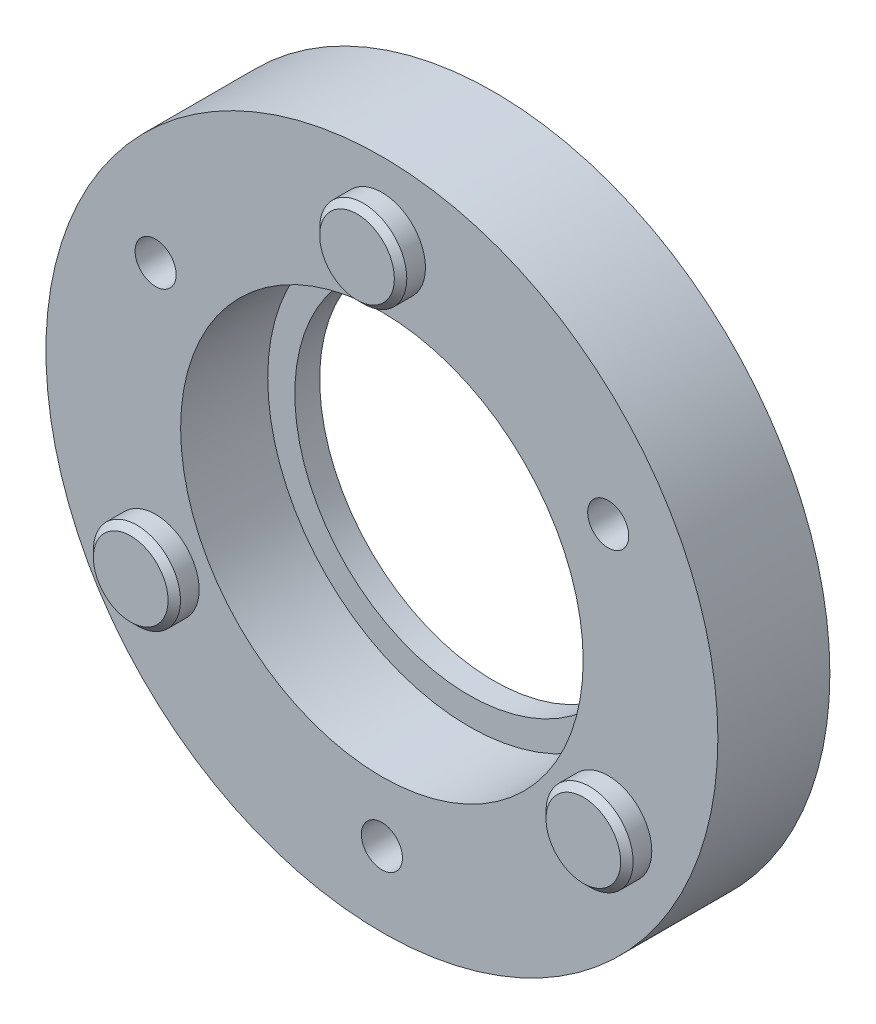
ISO-10303-21;
HEADER;
FILE_DESCRIPTION(('STEP AP214'),'2;1');
FILE_NAME('part.step','',(''),(''),'','','');
FILE_SCHEMA(('AUTOMOTIVE_DESIGN { 1 0 10303 214 1 1 1 1 }'));
ENDSEC;
DATA;
#1=APPLICATION_CONTEXT('core data for automotive mechanical design processes');
#2=APPLICATION_PROTOCOL_DEFINITION('international standard','automotive_design',2000,#1);
#3=PRODUCT_CONTEXT('',#1,'mechanical');
#4=PRODUCT('Part','Part','',(#3));
#5=PRODUCT_RELATED_PRODUCT_CATEGORY('part','',(#4));
#6=PRODUCT_DEFINITION_FORMATION('','',#4);
#7=PRODUCT_DEFINITION_CONTEXT('part definition',#1,'design');
#8=PRODUCT_DEFINITION('design','',#6,#7);
#9=PRODUCT_DEFINITION_SHAPE('','',#8);
#10=(LENGTH_UNIT() NAMED_UNIT(*) SI_UNIT(.MILLI.,.METRE.));
#11=(NAMED_UNIT(*) PLANE_ANGLE_UNIT() SI_UNIT($,.RADIAN.));
#12=(NAMED_UNIT(*) SI_UNIT($,.STERADIAN.) SOLID_ANGLE_UNIT());
#13=UNCERTAINTY_MEASURE_WITH_UNIT(LENGTH_MEASURE(1.E-05),#10,'distance_accuracy_value','');
#14=(GEOMETRIC_REPRESENTATION_CONTEXT(3) GLOBAL_UNCERTAINTY_ASSIGNED_CONTEXT((#13)) GLOBAL_UNIT_ASSIGNED_CONTEXT((#10,
#11,#12)) REPRESENTATION_CONTEXT('',''));
#15=CARTESIAN_POINT('',(0.,0.,0.));
#16=DIRECTION('',(0.,0.,1.));
#17=DIRECTION('',(1.,0.,0.));
#18=AXIS2_PLACEMENT_3D('',#15,#16,#17);
#19=CARTESIAN_POINT('',(0.,0.,9.));
#20=DIRECTION('',(0.,0.,-1.));
#21=DIRECTION('',(-1.,0.,0.));
#22=AXIS2_PLACEMENT_3D('',#19,#20,#21);
#23=CYLINDRICAL_SURFACE('',#22,27.);
#24=CARTESIAN_POINT('',(0.,0.,9.));
#25=DIRECTION('',(0.,0.,1.));
#26=DIRECTION('',(1.,0.,0.));
#27=AXIS2_PLACEMENT_3D('',#24,#25,#26);
#28=CIRCLE('',#27,27.);
#29=CARTESIAN_POINT('',(27.,0.,9.));
#30=VERTEX_POINT('',#29);
#31=EDGE_CURVE('E60',#30,#30,#28,.T.);
#32=ORIENTED_EDGE('',*,*,#31,.F.);
#33=EDGE_LOOP('',(#32));
#34=FACE_BOUND('',#33,.T.);
#35=CARTESIAN_POINT('',(0.,0.,0.));
#36=DIRECTION('',(0.,0.,1.));
#37=DIRECTION('',(1.,0.,0.));
#38=AXIS2_PLACEMENT_3D('',#35,#36,#37);
#39=CIRCLE('',#38,27.);
#40=CARTESIAN_POINT('',(27.,0.,0.));
#41=VERTEX_POINT('',#40);
#42=EDGE_CURVE('E61',#41,#41,#39,.T.);
#43=ORIENTED_EDGE('',*,*,#42,.T.);
#44=EDGE_LOOP('',(#43));
#45=FACE_BOUND('',#44,.T.);
#46=ADVANCED_FACE('F34',(#34,#45),#23,.T.);
#47=CARTESIAN_POINT('',(0.,0.,9.));
#48=DIRECTION('',(0.,0.,1.));
#49=DIRECTION('',(1.,0.,0.));
#50=AXIS2_PLACEMENT_3D('',#47,#48,#49);
#51=PLANE('',#50);
#52=CARTESIAN_POINT('',(18.1865334794732,-10.5000000000001,9.));
#53=DIRECTION('',(0.,0.,1.));
#54=DIRECTION('',(1.,0.,0.));
#55=AXIS2_PLACEMENT_3D('',#52,#53,#54);
#56=CIRCLE('',#55,3.5);
#57=CARTESIAN_POINT('',(21.6865334794732,-10.5000000000001,9.));
#58=VERTEX_POINT('',#57);
#59=EDGE_CURVE('E120',#58,#58,#56,.T.);
#60=ORIENTED_EDGE('',*,*,#59,.F.);
#61=EDGE_LOOP('',(#60));
#62=FACE_BOUND('',#61,.T.);
#63=CARTESIAN_POINT('',(-18.1865334794732,-10.5000000000001,9.));
#64=DIRECTION('',(0.,0.,1.));
#65=DIRECTION('',(1.,0.,0.));
#66=AXIS2_PLACEMENT_3D('',#63,#64,#65);
#67=CIRCLE('',#66,3.5);
#68=CARTESIAN_POINT('',(-14.6865334794732,-10.5000000000001,9.));
#69=VERTEX_POINT('',#68);
#70=EDGE_CURVE('E117',#69,#69,#67,.T.);
#71=ORIENTED_EDGE('',*,*,#70,.F.);
#72=EDGE_LOOP('',(#71));
#73=FACE_BOUND('',#72,.T.);
#74=CARTESIAN_POINT('',(0.,21.,9.));
#75=DIRECTION('',(0.,0.,1.));
#76=DIRECTION('',(1.,0.,0.));
#77=AXIS2_PLACEMENT_3D('',#74,#75,#76);
#78=CIRCLE('',#77,3.5);
#79=CARTESIAN_POINT('',(3.5,21.,9.));
#80=VERTEX_POINT('',#79);
#81=EDGE_CURVE('E107',#80,#80,#78,.T.);
#82=ORIENTED_EDGE('',*,*,#81,.F.);
#83=EDGE_LOOP('',(#82));
#84=FACE_BOUND('',#83,.T.);
#85=CARTESIAN_POINT('',(18.1865334794732,10.5,9.));
#86=DIRECTION('',(0.,0.,1.));
#87=DIRECTION('',(1.,0.,0.));
#88=AXIS2_PLACEMENT_3D('',#85,#86,#87);
#89=CIRCLE('',#88,1.65);
#90=CARTESIAN_POINT('',(19.8365334794732,10.5,9.));
#91=VERTEX_POINT('',#90);
#92=EDGE_CURVE('E92',#91,#91,#89,.T.);
#93=ORIENTED_EDGE('',*,*,#92,.F.);
#94=EDGE_LOOP('',(#93));
#95=FACE_BOUND('',#94,.T.);
#96=CARTESIAN_POINT('',(0.,-21.,9.));
#97=DIRECTION('',(0.,0.,1.));
#98=DIRECTION('',(1.,0.,0.));
#99=AXIS2_PLACEMENT_3D('',#96,#97,#98);
#100=CIRCLE('',#99,1.65);
#101=CARTESIAN_POINT('',(1.65,-21.,9.));
#102=VERTEX_POINT('',#101);
#103=EDGE_CURVE('E85',#102,#102,#100,.T.);
#104=ORIENTED_EDGE('',*,*,#103,.F.);
#105=EDGE_LOOP('',(#104));
#106=FACE_BOUND('',#105,.T.);
#107=CARTESIAN_POINT('',(-18.1865334794732,10.5,9.));
#108=DIRECTION('',(0.,0.,1.));
#109=DIRECTION('',(1.,0.,0.));
#110=AXIS2_PLACEMENT_3D('',#107,#108,#109);
#111=CIRCLE('',#110,1.65);
#112=CARTESIAN_POINT('',(-16.5365334794732,10.5,9.));
#113=VERTEX_POINT('',#112);
#114=EDGE_CURVE('E79',#113,#113,#111,.T.);
#115=ORIENTED_EDGE('',*,*,#114,.F.);
#116=EDGE_LOOP('',(#115));
#117=FACE_BOUND('',#116,.T.);
#118=CARTESIAN_POINT('',(0.,0.,9.));
#119=DIRECTION('',(0.,0.,1.));
#120=DIRECTION('',(1.,0.,0.));
#121=AXIS2_PLACEMENT_3D('',#118,#119,#120);
#122=CIRCLE('',#121,16.175);
#123=CARTESIAN_POINT('',(16.175,0.,9.));
#124=VERTEX_POINT('',#123);
#125=EDGE_CURVE('E67',#124,#124,#122,.T.);
#126=ORIENTED_EDGE('',*,*,#125,.F.);
#127=EDGE_LOOP('',(#126));
#128=FACE_BOUND('',#127,.T.);
#129=ORIENTED_EDGE('',*,*,#31,.T.);
#130=EDGE_LOOP('',(#129));
#131=FACE_BOUND('',#130,.T.);
#132=ADVANCED_FACE('F126',(#62,#73,#84,#95,#106,#117,#128,#131),#51,.T.);
#133=CARTESIAN_POINT('',(0.,0.,0.));
#134=DIRECTION('',(0.,0.,1.));
#135=DIRECTION('',(1.,0.,0.));
#136=AXIS2_PLACEMENT_3D('',#133,#134,#135);
#137=PLANE('',#136);
#138=CARTESIAN_POINT('',(18.1865334794732,-10.5000000000001,0.));
#139=DIRECTION('',(0.,0.,-1.));
#140=DIRECTION('',(-1.,0.,0.));
#141=AXIS2_PLACEMENT_3D('',#138,#139,#140);
#142=CIRCLE('',#141,3.65);
#143=CARTESIAN_POINT('',(14.5365334794732,-10.5000000000001,0.));
#144=VERTEX_POINT('',#143);
#145=EDGE_CURVE('E110',#144,#144,#142,.T.);
#146=ORIENTED_EDGE('',*,*,#145,.F.);
#147=EDGE_LOOP('',(#146));
#148=FACE_BOUND('',#147,.T.);
#149=CARTESIAN_POINT('',(-18.1865334794732,-10.5000000000001,0.));
#150=DIRECTION('',(0.,0.,-1.));
#151=DIRECTION('',(-1.,0.,0.));
#152=AXIS2_PLACEMENT_3D('',#149,#150,#151);
#153=CIRCLE('',#152,3.65);
#154=CARTESIAN_POINT('',(-21.8365334794732,-10.5000000000001,0.));
#155=VERTEX_POINT('',#154);
#156=EDGE_CURVE('E103',#155,#155,#153,.T.);
#157=ORIENTED_EDGE('',*,*,#156,.F.);
#158=EDGE_LOOP('',(#157));
#159=FACE_BOUND('',#158,.T.);
#160=CARTESIAN_POINT('',(0.,21.,0.));
#161=DIRECTION('',(0.,0.,-1.));
#162=DIRECTION('',(-1.,0.,0.));
#163=AXIS2_PLACEMENT_3D('',#160,#161,#162);
#164=CIRCLE('',#163,3.65);
#165=CARTESIAN_POINT('',(-3.65,21.,0.));
#166=VERTEX_POINT('',#165);
#167=EDGE_CURVE('E97',#166,#166,#164,.T.);
#168=ORIENTED_EDGE('',*,*,#167,.F.);
#169=EDGE_LOOP('',(#168));
#170=FACE_BOUND('',#169,.T.);
#171=CARTESIAN_POINT('',(18.1865334794732,10.5,0.));
#172=DIRECTION('',(0.,0.,1.));
#173=DIRECTION('',(1.,0.,0.));
#174=AXIS2_PLACEMENT_3D('',#171,#172,#173);
#175=CIRCLE('',#174,1.65);
#176=CARTESIAN_POINT('',(19.8365334794732,10.5,0.));
#177=VERTEX_POINT('',#176);
#178=EDGE_CURVE('E82',#177,#177,#175,.T.);
#179=ORIENTED_EDGE('',*,*,#178,.T.);
#180=EDGE_LOOP('',(#179));
#181=FACE_BOUND('',#180,.T.);
#182=CARTESIAN_POINT('',(0.,-21.,0.));
#183=DIRECTION('',(0.,0.,1.));
#184=DIRECTION('',(1.,0.,0.));
#185=AXIS2_PLACEMENT_3D('',#182,#183,#184);
#186=CIRCLE('',#185,1.65);
#187=CARTESIAN_POINT('',(1.65,-21.,0.));
#188=VERTEX_POINT('',#187);
#189=EDGE_CURVE('E88',#188,#188,#186,.T.);
#190=ORIENTED_EDGE('',*,*,#189,.T.);
#191=EDGE_LOOP('',(#190));
#192=FACE_BOUND('',#191,.T.);
#193=CARTESIAN_POINT('',(-18.1865334794732,10.5,0.));
#194=DIRECTION('',(0.,0.,1.));
#195=DIRECTION('',(1.,0.,0.));
#196=AXIS2_PLACEMENT_3D('',#193,#194,#195);
#197=CIRCLE('',#196,1.65);
#198=CARTESIAN_POINT('',(-16.5365334794732,10.5,0.));
#199=VERTEX_POINT('',#198);
#200=EDGE_CURVE('E76',#199,#199,#197,.T.);
#201=ORIENTED_EDGE('',*,*,#200,.T.);
#202=EDGE_LOOP('',(#201));
#203=FACE_BOUND('',#202,.T.);
#204=CARTESIAN_POINT('',(0.,0.,0.));
#205=DIRECTION('',(0.,0.,1.));
#206=DIRECTION('',(1.,0.,0.));
#207=AXIS2_PLACEMENT_3D('',#204,#205,#206);
#208=CIRCLE('',#207,14.);
#209=CARTESIAN_POINT('',(14.,0.,0.));
#210=VERTEX_POINT('',#209);
#211=EDGE_CURVE('E70',#210,#210,#208,.T.);
#212=ORIENTED_EDGE('',*,*,#211,.T.);
#213=EDGE_LOOP('',(#212));
#214=FACE_BOUND('',#213,.T.);
#215=ORIENTED_EDGE('',*,*,#42,.F.);
#216=EDGE_LOOP('',(#215));
#217=FACE_BOUND('',#216,.T.);
#218=ADVANCED_FACE('F129',(#148,#159,#170,#181,#192,#203,#214,#217),#137,.F.);
#219=CARTESIAN_POINT('',(0.,0.,2.));
#220=DIRECTION('',(0.,0.,1.));
#221=DIRECTION('',(1.,0.,0.));
#222=AXIS2_PLACEMENT_3D('',#219,#220,#221);
#223=CYLINDRICAL_SURFACE('',#222,16.175);
#224=CARTESIAN_POINT('',(0.,0.,2.));
#225=DIRECTION('',(0.,0.,1.));
#226=DIRECTION('',(1.,0.,0.));
#227=AXIS2_PLACEMENT_3D('',#224,#225,#226);
#228=CIRCLE('',#227,16.175);
#229=CARTESIAN_POINT('',(16.175,0.,2.));
#230=VERTEX_POINT('',#229);
#231=EDGE_CURVE('E64',#230,#230,#228,.T.);
#232=ORIENTED_EDGE('',*,*,#231,.F.);
#233=EDGE_LOOP('',(#232));
#234=FACE_BOUND('',#233,.T.);
#235=ORIENTED_EDGE('',*,*,#125,.T.);
#236=EDGE_LOOP('',(#235));
#237=FACE_BOUND('',#236,.T.);
#238=ADVANCED_FACE('F151',(#234,#237),#223,.F.);
#239=CARTESIAN_POINT('',(0.,0.,2.));
#240=DIRECTION('',(0.,0.,1.));
#241=DIRECTION('',(1.,0.,0.));
#242=AXIS2_PLACEMENT_3D('',#239,#240,#241);
#243=PLANE('',#242);
#244=CARTESIAN_POINT('',(0.,0.,2.));
#245=DIRECTION('',(0.,0.,1.));
#246=DIRECTION('',(1.,0.,0.));
#247=AXIS2_PLACEMENT_3D('',#244,#245,#246);
#248=CIRCLE('',#247,14.);
#249=CARTESIAN_POINT('',(14.,0.,2.));
#250=VERTEX_POINT('',#249);
#251=EDGE_CURVE('E73',#250,#250,#248,.T.);
#252=ORIENTED_EDGE('',*,*,#251,.F.);
#253=EDGE_LOOP('',(#252));
#254=FACE_BOUND('',#253,.T.);
#255=ORIENTED_EDGE('',*,*,#231,.T.);
#256=EDGE_LOOP('',(#255));
#257=FACE_BOUND('',#256,.T.);
#258=ADVANCED_FACE('F157',(#254,#257),#243,.T.);
#259=CARTESIAN_POINT('',(0.,0.,0.));
#260=DIRECTION('',(0.,0.,1.));
#261=DIRECTION('',(1.,0.,0.));
#262=AXIS2_PLACEMENT_3D('',#259,#260,#261);
#263=CYLINDRICAL_SURFACE('',#262,14.);
#264=ORIENTED_EDGE('',*,*,#211,.F.);
#265=EDGE_LOOP('',(#264));
#266=FACE_BOUND('',#265,.T.);
#267=ORIENTED_EDGE('',*,*,#251,.T.);
#268=EDGE_LOOP('',(#267));
#269=FACE_BOUND('',#268,.T.);
#270=ADVANCED_FACE('F235',(#266,#269),#263,.F.);
#271=CARTESIAN_POINT('',(-18.1865334794732,10.5,0.));
#272=DIRECTION('',(0.,0.,1.));
#273=DIRECTION('',(1.,0.,0.));
#274=AXIS2_PLACEMENT_3D('',#271,#272,#273);
#275=CYLINDRICAL_SURFACE('',#274,1.65);
#276=ORIENTED_EDGE('',*,*,#200,.F.);
#277=EDGE_LOOP('',(#276));
#278=FACE_BOUND('',#277,.T.);
#279=ORIENTED_EDGE('',*,*,#114,.T.);
#280=EDGE_LOOP('',(#279));
#281=FACE_BOUND('',#280,.T.);
#282=ADVANCED_FACE('F231',(#278,#281),#275,.F.);
#283=CARTESIAN_POINT('',(0.,-21.,0.));
#284=DIRECTION('',(0.,0.,1.));
#285=DIRECTION('',(1.,0.,0.));
#286=AXIS2_PLACEMENT_3D('',#283,#284,#285);
#287=CYLINDRICAL_SURFACE('',#286,1.65);
#288=ORIENTED_EDGE('',*,*,#189,.F.);
#289=EDGE_LOOP('',(#288));
#290=FACE_BOUND('',#289,.T.);
#291=ORIENTED_EDGE('',*,*,#103,.T.);
#292=EDGE_LOOP('',(#291));
#293=FACE_BOUND('',#292,.T.);
#294=ADVANCED_FACE('F227',(#290,#293),#287,.F.);
#295=CARTESIAN_POINT('',(18.1865334794732,10.5,0.));
#296=DIRECTION('',(0.,0.,1.));
#297=DIRECTION('',(1.,0.,0.));
#298=AXIS2_PLACEMENT_3D('',#295,#296,#297);
#299=CYLINDRICAL_SURFACE('',#298,1.65);
#300=ORIENTED_EDGE('',*,*,#178,.F.);
#301=EDGE_LOOP('',(#300));
#302=FACE_BOUND('',#301,.T.);
#303=ORIENTED_EDGE('',*,*,#92,.T.);
#304=EDGE_LOOP('',(#303));
#305=FACE_BOUND('',#304,.T.);
#306=ADVANCED_FACE('F223',(#302,#305),#299,.F.);
#307=CARTESIAN_POINT('',(0.,21.,3.));
#308=DIRECTION('',(0.,0.,-1.));
#309=DIRECTION('',(-1.,0.,0.));
#310=AXIS2_PLACEMENT_3D('',#307,#308,#309);
#311=CYLINDRICAL_SURFACE('',#310,3.65);
#312=CARTESIAN_POINT('',(0.,21.,3.));
#313=DIRECTION('',(0.,0.,-1.));
#314=DIRECTION('',(-1.,0.,0.));
#315=AXIS2_PLACEMENT_3D('',#312,#313,#314);
#316=CIRCLE('',#315,3.65);
#317=CARTESIAN_POINT('',(-3.65,21.,3.));
#318=VERTEX_POINT('',#317);
#319=EDGE_CURVE('E89',#318,#318,#316,.T.);
#320=ORIENTED_EDGE('',*,*,#319,.F.);
#321=EDGE_LOOP('',(#320));
#322=FACE_BOUND('',#321,.T.);
#323=ORIENTED_EDGE('',*,*,#167,.T.);
#324=EDGE_LOOP('',(#323));
#325=FACE_BOUND('',#324,.T.);
#326=ADVANCED_FACE('F219',(#322,#325),#311,.F.);
#327=CARTESIAN_POINT('',(0.,21.,3.));
#328=DIRECTION('',(0.,0.,-1.));
#329=DIRECTION('',(-1.,0.,0.));
#330=AXIS2_PLACEMENT_3D('',#327,#328,#329);
#331=PLANE('',#330);
#332=ORIENTED_EDGE('',*,*,#319,.T.);
#333=EDGE_LOOP('',(#332));
#334=FACE_BOUND('',#333,.T.);
#335=ADVANCED_FACE('F215',(#334),#331,.T.);
#336=CARTESIAN_POINT('',(-18.1865334794732,-10.5000000000001,3.));
#337=DIRECTION('',(0.,0.,-1.));
#338=DIRECTION('',(-1.,0.,0.));
#339=AXIS2_PLACEMENT_3D('',#336,#337,#338);
#340=CYLINDRICAL_SURFACE('',#339,3.65);
#341=CARTESIAN_POINT('',(-18.1865334794732,-10.5000000000001,3.));
#342=DIRECTION('',(0.,0.,-1.));
#343=DIRECTION('',(-1.,0.,0.));
#344=AXIS2_PLACEMENT_3D('',#341,#342,#343);
#345=CIRCLE('',#344,3.65);
#346=CARTESIAN_POINT('',(-21.8365334794732,-10.5000000000001,3.));
#347=VERTEX_POINT('',#346);
#348=EDGE_CURVE('E106',#347,#347,#345,.T.);
#349=ORIENTED_EDGE('',*,*,#348,.F.);
#350=EDGE_LOOP('',(#349));
#351=FACE_BOUND('',#350,.T.);
#352=ORIENTED_EDGE('',*,*,#156,.T.);
#353=EDGE_LOOP('',(#352));
#354=FACE_BOUND('',#353,.T.);
#355=ADVANCED_FACE('F211',(#351,#354),#340,.F.);
#356=CARTESIAN_POINT('',(-18.1865334794732,-10.5000000000001,3.));
#357=DIRECTION('',(0.,0.,-1.));
#358=DIRECTION('',(-1.,0.,0.));
#359=AXIS2_PLACEMENT_3D('',#356,#357,#358);
#360=PLANE('',#359);
#361=ORIENTED_EDGE('',*,*,#348,.T.);
#362=EDGE_LOOP('',(#361));
#363=FACE_BOUND('',#362,.T.);
#364=ADVANCED_FACE('F207',(#363),#360,.T.);
#365=CARTESIAN_POINT('',(18.1865334794732,-10.5000000000001,3.));
#366=DIRECTION('',(0.,0.,-1.));
#367=DIRECTION('',(-1.,0.,0.));
#368=AXIS2_PLACEMENT_3D('',#365,#366,#367);
#369=CYLINDRICAL_SURFACE('',#368,3.65);
#370=CARTESIAN_POINT('',(18.1865334794732,-10.5000000000001,3.));
#371=DIRECTION('',(0.,0.,-1.));
#372=DIRECTION('',(-1.,0.,0.));
#373=AXIS2_PLACEMENT_3D('',#370,#371,#372);
#374=CIRCLE('',#373,3.65);
#375=CARTESIAN_POINT('',(14.5365334794732,-10.5000000000001,3.));
#376=VERTEX_POINT('',#375);
#377=EDGE_CURVE('E100',#376,#376,#374,.T.);
#378=ORIENTED_EDGE('',*,*,#377,.F.);
#379=EDGE_LOOP('',(#378));
#380=FACE_BOUND('',#379,.T.);
#381=ORIENTED_EDGE('',*,*,#145,.T.);
#382=EDGE_LOOP('',(#381));
#383=FACE_BOUND('',#382,.T.);
#384=ADVANCED_FACE('F203',(#380,#383),#369,.F.);
#385=CARTESIAN_POINT('',(18.1865334794732,-10.5000000000001,3.));
#386=DIRECTION('',(0.,0.,-1.));
#387=DIRECTION('',(-1.,0.,0.));
#388=AXIS2_PLACEMENT_3D('',#385,#386,#387);
#389=PLANE('',#388);
#390=ORIENTED_EDGE('',*,*,#377,.T.);
#391=EDGE_LOOP('',(#390));
#392=FACE_BOUND('',#391,.T.);
#393=ADVANCED_FACE('F200',(#392),#389,.T.);
#394=CARTESIAN_POINT('',(0.,21.,11.));
#395=DIRECTION('',(0.,0.,-1.));
#396=DIRECTION('',(-1.,0.,0.));
#397=AXIS2_PLACEMENT_3D('',#394,#395,#396);
#398=CYLINDRICAL_SURFACE('',#397,3.5);
#399=CARTESIAN_POINT('',(0.,21.,10.5));
#400=DIRECTION('',(0.,0.,1.));
#401=DIRECTION('',(1.,0.,0.));
#402=AXIS2_PLACEMENT_3D('',#399,#400,#401);
#403=CIRCLE('',#402,3.5);
#404=CARTESIAN_POINT('',(3.5,21.,10.5));
#405=VERTEX_POINT('',#404);
#406=EDGE_CURVE('E10',#405,#405,#403,.F.);
#407=ORIENTED_EDGE('',*,*,#406,.T.);
#408=EDGE_LOOP('',(#407));
#409=FACE_BOUND('',#408,.T.);
#410=ORIENTED_EDGE('',*,*,#81,.T.);
#411=EDGE_LOOP('',(#410));
#412=FACE_BOUND('',#411,.T.);
#413=ADVANCED_FACE('F197',(#409,#412),#398,.T.);
#414=CARTESIAN_POINT('',(0.,21.,11.));
#415=DIRECTION('',(0.,0.,1.));
#416=DIRECTION('',(1.,0.,0.));
#417=AXIS2_PLACEMENT_3D('',#414,#415,#416);
#418=PLANE('',#417);
#419=CARTESIAN_POINT('',(0.,21.,11.));
#420=DIRECTION('',(0.,0.,1.));
#421=DIRECTION('',(1.,0.,0.));
#422=AXIS2_PLACEMENT_3D('',#419,#420,#421);
#423=CIRCLE('',#422,3.00000000000002);
#424=CARTESIAN_POINT('',(3.00000000000002,21.,11.));
#425=VERTEX_POINT('',#424);
#426=EDGE_CURVE('E41',#425,#425,#423,.T.);
#427=ORIENTED_EDGE('',*,*,#426,.T.);
#428=EDGE_LOOP('',(#427));
#429=FACE_BOUND('',#428,.T.);
#430=ADVANCED_FACE('F193',(#429),#418,.T.);
#431=CARTESIAN_POINT('',(-18.1865334794732,-10.5000000000001,11.));
#432=DIRECTION('',(0.,0.,-1.));
#433=DIRECTION('',(-1.,0.,0.));
#434=AXIS2_PLACEMENT_3D('',#431,#432,#433);
#435=CYLINDRICAL_SURFACE('',#434,3.5);
#436=CARTESIAN_POINT('',(-18.1865334794732,-10.5000000000001,10.5));
#437=DIRECTION('',(0.,0.,1.));
#438=DIRECTION('',(1.,0.,0.));
#439=AXIS2_PLACEMENT_3D('',#436,#437,#438);
#440=CIRCLE('',#439,3.5);
#441=CARTESIAN_POINT('',(-14.6865334794732,-10.5000000000001,10.5));
#442=VERTEX_POINT('',#441);
#443=EDGE_CURVE('E54',#442,#442,#440,.F.);
#444=ORIENTED_EDGE('',*,*,#443,.T.);
#445=EDGE_LOOP('',(#444));
#446=FACE_BOUND('',#445,.T.);
#447=ORIENTED_EDGE('',*,*,#70,.T.);
#448=EDGE_LOOP('',(#447));
#449=FACE_BOUND('',#448,.T.);
#450=ADVANCED_FACE('F189',(#446,#449),#435,.T.);
#451=CARTESIAN_POINT('',(-18.1865334794732,-10.5000000000001,11.));
#452=DIRECTION('',(0.,0.,1.));
#453=DIRECTION('',(1.,0.,0.));
#454=AXIS2_PLACEMENT_3D('',#451,#452,#453);
#455=PLANE('',#454);
#456=CARTESIAN_POINT('',(-18.1865334794732,-10.5000000000001,11.));
#457=DIRECTION('',(0.,0.,1.));
#458=DIRECTION('',(1.,0.,0.));
#459=AXIS2_PLACEMENT_3D('',#456,#457,#458);
#460=CIRCLE('',#459,2.99999999999999);
#461=CARTESIAN_POINT('',(-15.1865334794732,-10.5000000000001,11.));
#462=VERTEX_POINT('',#461);
#463=EDGE_CURVE('E57',#462,#462,#460,.T.);
#464=ORIENTED_EDGE('',*,*,#463,.T.);
#465=EDGE_LOOP('',(#464));
#466=FACE_BOUND('',#465,.T.);
#467=ADVANCED_FACE('F183',(#466),#455,.T.);
#468=CARTESIAN_POINT('',(18.1865334794732,-10.5000000000001,11.));
#469=DIRECTION('',(0.,0.,-1.));
#470=DIRECTION('',(-1.,0.,0.));
#471=AXIS2_PLACEMENT_3D('',#468,#469,#470);
#472=CYLINDRICAL_SURFACE('',#471,3.5);
#473=CARTESIAN_POINT('',(18.1865334794732,-10.5000000000001,10.5));
#474=DIRECTION('',(0.,0.,1.));
#475=DIRECTION('',(1.,0.,0.));
#476=AXIS2_PLACEMENT_3D('',#473,#474,#475);
#477=CIRCLE('',#476,3.5);
#478=CARTESIAN_POINT('',(21.6865334794732,-10.5000000000001,10.5));
#479=VERTEX_POINT('',#478);
#480=EDGE_CURVE('E45',#479,#479,#477,.F.);
#481=ORIENTED_EDGE('',*,*,#480,.T.);
#482=EDGE_LOOP('',(#481));
#483=FACE_BOUND('',#482,.T.);
#484=ORIENTED_EDGE('',*,*,#59,.T.);
#485=EDGE_LOOP('',(#484));
#486=FACE_BOUND('',#485,.T.);
#487=ADVANCED_FACE('F124',(#483,#486),#472,.T.);
#488=CARTESIAN_POINT('',(18.1865334794732,-10.5000000000001,11.));
#489=DIRECTION('',(0.,0.,1.));
#490=DIRECTION('',(1.,0.,0.));
#491=AXIS2_PLACEMENT_3D('',#488,#489,#490);
#492=PLANE('',#491);
#493=CARTESIAN_POINT('',(18.1865334794732,-10.5000000000001,11.));
#494=DIRECTION('',(0.,0.,1.));
#495=DIRECTION('',(1.,0.,0.));
#496=AXIS2_PLACEMENT_3D('',#493,#494,#495);
#497=CIRCLE('',#496,3.00000000000001);
#498=CARTESIAN_POINT('',(21.1865334794732,-10.5000000000001,11.));
#499=VERTEX_POINT('',#498);
#500=EDGE_CURVE('E49',#499,#499,#497,.T.);
#501=ORIENTED_EDGE('',*,*,#500,.T.);
#502=EDGE_LOOP('',(#501));
#503=FACE_BOUND('',#502,.T.);
#504=ADVANCED_FACE('F166',(#503),#492,.T.);
#505=CARTESIAN_POINT('',(-18.1865334794732,-10.5000000000001,11.));
#506=DIRECTION('',(0.,0.,-1.));
#507=DIRECTION('',(-1.,0.,0.));
#508=AXIS2_PLACEMENT_3D('',#505,#506,#507);
#509=CONICAL_SURFACE('',#508,2.99999999999999,0.785398163397433);
#510=ORIENTED_EDGE('',*,*,#443,.F.);
#511=EDGE_LOOP('',(#510));
#512=FACE_BOUND('',#511,.T.);
#513=ORIENTED_EDGE('',*,*,#463,.F.);
#514=EDGE_LOOP('',(#513));
#515=FACE_BOUND('',#514,.T.);
#516=ADVANCED_FACE('F163',(#512,#515),#509,.T.);
#517=CARTESIAN_POINT('',(18.1865334794732,-10.5000000000001,11.));
#518=DIRECTION('',(0.,0.,-1.));
#519=DIRECTION('',(-1.,0.,0.));
#520=AXIS2_PLACEMENT_3D('',#517,#518,#519);
#521=CONICAL_SURFACE('',#520,3.00000000000001,0.785398163397436);
#522=ORIENTED_EDGE('',*,*,#480,.F.);
#523=EDGE_LOOP('',(#522));
#524=FACE_BOUND('',#523,.T.);
#525=ORIENTED_EDGE('',*,*,#500,.F.);
#526=EDGE_LOOP('',(#525));
#527=FACE_BOUND('',#526,.T.);
#528=ADVANCED_FACE('F165',(#524,#527),#521,.T.);
#529=CARTESIAN_POINT('',(0.,21.,11.));
#530=DIRECTION('',(0.,0.,-1.));
#531=DIRECTION('',(-1.,0.,0.));
#532=AXIS2_PLACEMENT_3D('',#529,#530,#531);
#533=CONICAL_SURFACE('',#532,3.00000000000002,0.785398163397443);
#534=ORIENTED_EDGE('',*,*,#406,.F.);
#535=EDGE_LOOP('',(#534));
#536=FACE_BOUND('',#535,.T.);
#537=ORIENTED_EDGE('',*,*,#426,.F.);
#538=EDGE_LOOP('',(#537));
#539=FACE_BOUND('',#538,.T.);
#540=ADVANCED_FACE('F36',(#536,#539),#533,.T.);
#541=CLOSED_SHELL('',(#46,#132,#218,#238,#258,#270,#282,#294,#306,#326,#335,#355,#364,#384,#393,
#413,#430,#450,#467,#487,#504,#516,#528,#540));
#542=MANIFOLD_SOLID_BREP('B2',#541);
#543=ADVANCED_BREP_SHAPE_REPRESENTATION('',(#18,#542),#14);
#544=SHAPE_DEFINITION_REPRESENTATION(#9,#543);
ENDSEC;
END-ISO-10303-21;
